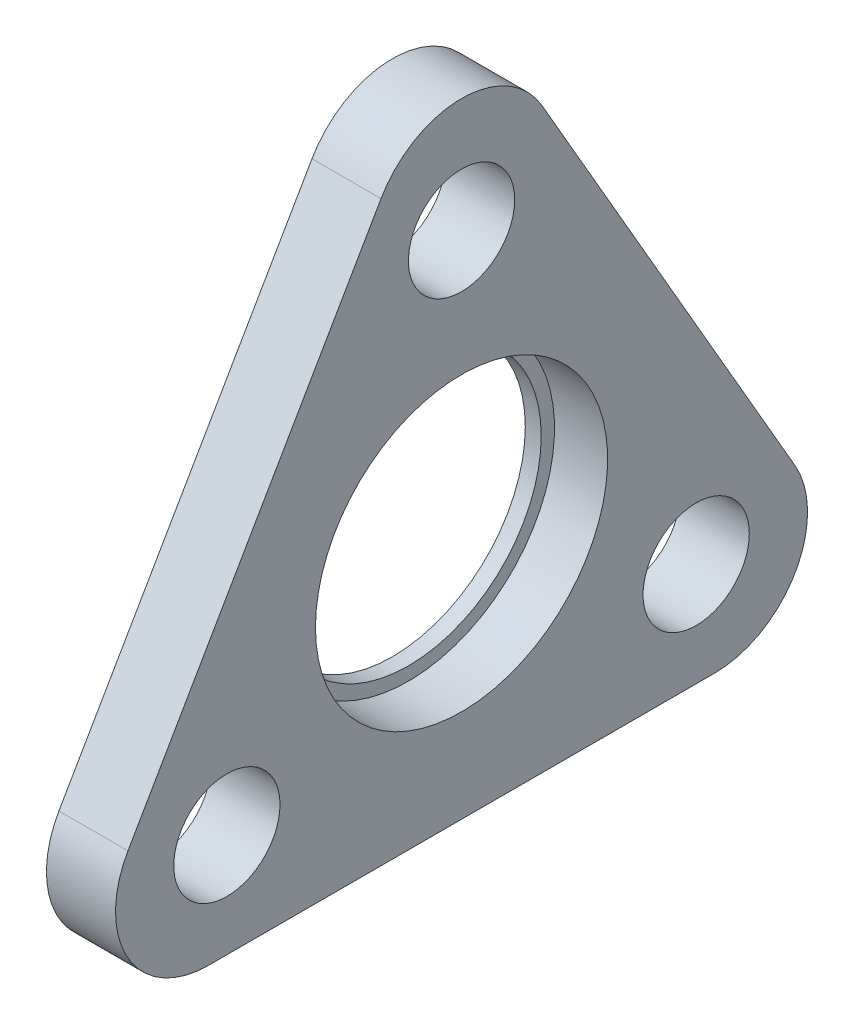
ISO-10303-21;
HEADER;
FILE_DESCRIPTION(('STEP AP214'),'2;1');
FILE_NAME('part.step','',(''),(''),'','','');
FILE_SCHEMA(('AUTOMOTIVE_DESIGN { 1 0 10303 214 1 1 1 1 }'));
ENDSEC;
DATA;
#1=APPLICATION_CONTEXT('core data for automotive mechanical design processes');
#2=APPLICATION_PROTOCOL_DEFINITION('international standard','automotive_design',2000,#1);
#3=PRODUCT_CONTEXT('',#1,'mechanical');
#4=PRODUCT('Part','Part','',(#3));
#5=PRODUCT_RELATED_PRODUCT_CATEGORY('part','',(#4));
#6=PRODUCT_DEFINITION_FORMATION('','',#4);
#7=PRODUCT_DEFINITION_CONTEXT('part definition',#1,'design');
#8=PRODUCT_DEFINITION('design','',#6,#7);
#9=PRODUCT_DEFINITION_SHAPE('','',#8);
#10=(LENGTH_UNIT() NAMED_UNIT(*) SI_UNIT(.MILLI.,.METRE.));
#11=(NAMED_UNIT(*) PLANE_ANGLE_UNIT() SI_UNIT($,.RADIAN.));
#12=(NAMED_UNIT(*) SI_UNIT($,.STERADIAN.) SOLID_ANGLE_UNIT());
#13=UNCERTAINTY_MEASURE_WITH_UNIT(LENGTH_MEASURE(1.E-05),#10,'distance_accuracy_value','');
#14=(GEOMETRIC_REPRESENTATION_CONTEXT(3) GLOBAL_UNCERTAINTY_ASSIGNED_CONTEXT((#13)) GLOBAL_UNIT_ASSIGNED_CONTEXT((#10,
#11,#12)) REPRESENTATION_CONTEXT('',''));
#15=CARTESIAN_POINT('',(0.,0.,0.));
#16=DIRECTION('',(0.,0.,1.));
#17=DIRECTION('',(1.,0.,0.));
#18=AXIS2_PLACEMENT_3D('',#15,#16,#17);
#19=CARTESIAN_POINT('',(0.6,0.,0.));
#20=DIRECTION('',(-1.,0.,0.));
#21=DIRECTION('',(0.,0.,1.));
#22=AXIS2_PLACEMENT_3D('',#19,#20,#21);
#23=CYLINDRICAL_SURFACE('',#22,5.5);
#24=CARTESIAN_POINT('',(0.6,0.,0.));
#25=DIRECTION('',(-1.,0.,0.));
#26=DIRECTION('',(0.,0.,1.));
#27=AXIS2_PLACEMENT_3D('',#24,#25,#26);
#28=CIRCLE('',#27,5.5);
#29=CARTESIAN_POINT('',(0.6,0.,5.5));
#30=VERTEX_POINT('',#29);
#31=EDGE_CURVE('E11',#30,#30,#28,.T.);
#32=ORIENTED_EDGE('',*,*,#31,.T.);
#33=EDGE_LOOP('',(#32));
#34=FACE_BOUND('',#33,.T.);
#35=CARTESIAN_POINT('',(0.,0.,0.));
#36=DIRECTION('',(-1.,0.,0.));
#37=DIRECTION('',(0.,0.,1.));
#38=AXIS2_PLACEMENT_3D('',#35,#36,#37);
#39=CIRCLE('',#38,5.5);
#40=CARTESIAN_POINT('',(0.,0.,5.5));
#41=VERTEX_POINT('',#40);
#42=EDGE_CURVE('E54',#41,#41,#39,.T.);
#43=ORIENTED_EDGE('',*,*,#42,.F.);
#44=EDGE_LOOP('',(#43));
#45=FACE_BOUND('',#44,.T.);
#46=ADVANCED_FACE('F51',(#34,#45),#23,.T.);
#47=CARTESIAN_POINT('',(0.6,0.,0.));
#48=DIRECTION('',(-1.,0.,0.));
#49=DIRECTION('',(0.,0.,1.));
#50=AXIS2_PLACEMENT_3D('',#47,#48,#49);
#51=PLANE('',#50);
#52=CARTESIAN_POINT('',(0.6,0.,0.));
#53=DIRECTION('',(-1.,0.,0.));
#54=DIRECTION('',(0.,0.,1.));
#55=AXIS2_PLACEMENT_3D('',#52,#53,#54);
#56=CIRCLE('',#55,5.);
#57=CARTESIAN_POINT('',(0.6,0.,5.));
#58=VERTEX_POINT('',#57);
#59=EDGE_CURVE('E61',#58,#58,#56,.T.);
#60=ORIENTED_EDGE('',*,*,#59,.T.);
#61=EDGE_LOOP('',(#60));
#62=FACE_BOUND('',#61,.T.);
#63=ORIENTED_EDGE('',*,*,#31,.F.);
#64=EDGE_LOOP('',(#63));
#65=FACE_BOUND('',#64,.T.);
#66=ADVANCED_FACE('F69',(#62,#65),#51,.F.);
#67=CARTESIAN_POINT('',(0.,0.,0.));
#68=DIRECTION('',(-1.,0.,0.));
#69=DIRECTION('',(0.,0.,1.));
#70=AXIS2_PLACEMENT_3D('',#67,#68,#69);
#71=PLANE('',#70);
#72=CARTESIAN_POINT('',(0.,0.,0.));
#73=DIRECTION('',(-1.,0.,0.));
#74=DIRECTION('',(0.,0.,1.));
#75=AXIS2_PLACEMENT_3D('',#72,#73,#74);
#76=CIRCLE('',#75,5.);
#77=CARTESIAN_POINT('',(0.,0.,5.));
#78=VERTEX_POINT('',#77);
#79=EDGE_CURVE('E63',#78,#78,#76,.T.);
#80=ORIENTED_EDGE('',*,*,#79,.F.);
#81=EDGE_LOOP('',(#80));
#82=FACE_BOUND('',#81,.T.);
#83=ORIENTED_EDGE('',*,*,#42,.T.);
#84=EDGE_LOOP('',(#83));
#85=FACE_BOUND('',#84,.T.);
#86=ADVANCED_FACE('F75',(#82,#85),#71,.T.);
#87=CARTESIAN_POINT('',(0.6,0.,0.));
#88=DIRECTION('',(-1.,0.,0.));
#89=DIRECTION('',(0.,0.,1.));
#90=AXIS2_PLACEMENT_3D('',#87,#88,#89);
#91=CYLINDRICAL_SURFACE('',#90,5.);
#92=ORIENTED_EDGE('',*,*,#59,.F.);
#93=EDGE_LOOP('',(#92));
#94=FACE_BOUND('',#93,.T.);
#95=ORIENTED_EDGE('',*,*,#79,.T.);
#96=EDGE_LOOP('',(#95));
#97=FACE_BOUND('',#96,.T.);
#98=ADVANCED_FACE('F72',(#94,#97),#91,.F.);
#99=CLOSED_SHELL('',(#46,#66,#86,#98));
#100=MANIFOLD_SOLID_BREP('B2',#99);
#101=CARTESIAN_POINT('',(2.6,4.49999999999996,7.79422863405993));
#102=DIRECTION('',(0.,-0.499999999999998,-0.86602540378444));
#103=DIRECTION('',(0.,0.86602540378444,-0.499999999999998));
#104=AXIS2_PLACEMENT_3D('',#101,#102,#103);
#105=PLANE('',#104);
#106=DIRECTION('',(0.,-0.86602540378444,0.499999999999998));
#107=VECTOR('',#106,1.);
#108=CARTESIAN_POINT('',(0.,4.49999999999996,7.79422863405993));
#109=LINE('',#108,#107);
#110=CARTESIAN_POINT('',(0.,12.75,3.03108891324554));
#111=VERTEX_POINT('',#110);
#112=CARTESIAN_POINT('',(0.,-3.75000000000009,12.5573683548743));
#113=VERTEX_POINT('',#112);
#114=EDGE_CURVE('E198',#111,#113,#109,.T.);
#115=ORIENTED_EDGE('',*,*,#114,.T.);
#116=DIRECTION('',(-1.,0.,0.));
#117=VECTOR('',#116,1.);
#118=CARTESIAN_POINT('',(2.6,-3.75000000000008,12.5573683548743));
#119=LINE('',#118,#117);
#120=CARTESIAN_POINT('',(2.6,-3.75000000000009,12.5573683548743));
#121=VERTEX_POINT('',#120);
#122=EDGE_CURVE('E173',#113,#121,#119,.F.);
#123=ORIENTED_EDGE('',*,*,#122,.T.);
#124=DIRECTION('',(0.,-0.86602540378444,0.499999999999998));
#125=VECTOR('',#124,1.);
#126=CARTESIAN_POINT('',(2.6,4.49999999999996,7.79422863405993));
#127=LINE('',#126,#125);
#128=CARTESIAN_POINT('',(2.6,12.75,3.03108891324554));
#129=VERTEX_POINT('',#128);
#130=EDGE_CURVE('E219',#129,#121,#127,.T.);
#131=ORIENTED_EDGE('',*,*,#130,.F.);
#132=DIRECTION('',(-1.,0.,0.));
#133=VECTOR('',#132,1.);
#134=CARTESIAN_POINT('',(2.6,12.75,3.03108891324554));
#135=LINE('',#134,#133);
#136=EDGE_CURVE('E179',#129,#111,#135,.T.);
#137=ORIENTED_EDGE('',*,*,#136,.T.);
#138=EDGE_LOOP('',(#115,#123,#131,#137));
#139=FACE_BOUND('',#138,.T.);
#140=ADVANCED_FACE('F113',(#139),#105,.F.);
#141=CARTESIAN_POINT('',(2.6,-9.00000000000008,0.));
#142=DIRECTION('',(0.,1.,0.));
#143=DIRECTION('',(0.,0.,1.));
#144=AXIS2_PLACEMENT_3D('',#141,#142,#143);
#145=PLANE('',#144);
#146=DIRECTION('',(0.,0.,-1.));
#147=VECTOR('',#146,1.);
#148=CARTESIAN_POINT('',(2.6,-9.00000000000008,0.));
#149=LINE('',#148,#147);
#150=CARTESIAN_POINT('',(2.6,-9.00000000000008,9.5262794416288));
#151=VERTEX_POINT('',#150);
#152=CARTESIAN_POINT('',(2.6,-9.00000000000008,-9.5262794416288));
#153=VERTEX_POINT('',#152);
#154=EDGE_CURVE('E188',#151,#153,#149,.T.);
#155=ORIENTED_EDGE('',*,*,#154,.F.);
#156=DIRECTION('',(-1.,0.,0.));
#157=VECTOR('',#156,1.);
#158=CARTESIAN_POINT('',(2.6,-9.00000000000008,9.5262794416288));
#159=LINE('',#158,#157);
#160=CARTESIAN_POINT('',(0.,-9.00000000000008,9.5262794416288));
#161=VERTEX_POINT('',#160);
#162=EDGE_CURVE('E172',#151,#161,#159,.T.);
#163=ORIENTED_EDGE('',*,*,#162,.T.);
#164=DIRECTION('',(0.,0.,-1.));
#165=VECTOR('',#164,1.);
#166=CARTESIAN_POINT('',(0.,-9.00000000000008,0.));
#167=LINE('',#166,#165);
#168=CARTESIAN_POINT('',(0.,-9.00000000000008,-9.5262794416288));
#169=VERTEX_POINT('',#168);
#170=EDGE_CURVE('E186',#161,#169,#167,.T.);
#171=ORIENTED_EDGE('',*,*,#170,.T.);
#172=DIRECTION('',(-1.,0.,0.));
#173=VECTOR('',#172,1.);
#174=CARTESIAN_POINT('',(2.6,-9.00000000000008,-9.5262794416288));
#175=LINE('',#174,#173);
#176=EDGE_CURVE('E191',#169,#153,#175,.F.);
#177=ORIENTED_EDGE('',*,*,#176,.T.);
#178=EDGE_LOOP('',(#155,#163,#171,#177));
#179=FACE_BOUND('',#178,.T.);
#180=ADVANCED_FACE('F185',(#179),#145,.F.);
#181=CARTESIAN_POINT('',(2.6,-5.09999999999962,-8.83345911860193));
#182=DIRECTION('',(-1.,0.,0.));
#183=DIRECTION('',(0.,0.,1.));
#184=AXIS2_PLACEMENT_3D('',#181,#182,#183);
#185=CYLINDRICAL_SURFACE('',#184,2.00000000000056);
#186=CARTESIAN_POINT('',(2.6,-5.09999999999962,-8.83345911860193));
#187=DIRECTION('',(1.,0.,0.));
#188=DIRECTION('',(0.,0.,-1.));
#189=AXIS2_PLACEMENT_3D('',#186,#187,#188);
#190=CIRCLE('',#189,2.00000000000056);
#191=CARTESIAN_POINT('',(2.6,-5.09999999999962,-10.8334591186025));
#192=VERTEX_POINT('',#191);
#193=EDGE_CURVE('E243',#192,#192,#190,.T.);
#194=ORIENTED_EDGE('',*,*,#193,.T.);
#195=EDGE_LOOP('',(#194));
#196=FACE_BOUND('',#195,.T.);
#197=CARTESIAN_POINT('',(0.,-5.09999999999962,-8.83345911860193));
#198=DIRECTION('',(1.,0.,0.));
#199=DIRECTION('',(0.,0.,-1.));
#200=AXIS2_PLACEMENT_3D('',#197,#198,#199);
#201=CIRCLE('',#200,2.00000000000056);
#202=CARTESIAN_POINT('',(0.,-5.09999999999962,-10.8334591186025));
#203=VERTEX_POINT('',#202);
#204=EDGE_CURVE('E211',#203,#203,#201,.T.);
#205=ORIENTED_EDGE('',*,*,#204,.F.);
#206=EDGE_LOOP('',(#205));
#207=FACE_BOUND('',#206,.T.);
#208=ADVANCED_FACE('F293',(#196,#207),#185,.F.);
#209=CARTESIAN_POINT('',(2.6,-5.10000000000038,8.83345911860062));
#210=DIRECTION('',(-1.,0.,0.));
#211=DIRECTION('',(0.,0.,1.));
#212=AXIS2_PLACEMENT_3D('',#209,#210,#211);
#213=CYLINDRICAL_SURFACE('',#212,2.00000000000083);
#214=CARTESIAN_POINT('',(2.6,-5.10000000000038,8.83345911860062));
#215=DIRECTION('',(1.,0.,0.));
#216=DIRECTION('',(0.,0.,-1.));
#217=AXIS2_PLACEMENT_3D('',#214,#215,#216);
#218=CIRCLE('',#217,2.00000000000083);
#219=CARTESIAN_POINT('',(2.6,-5.10000000000038,6.8334591185998));
#220=VERTEX_POINT('',#219);
#221=EDGE_CURVE('E246',#220,#220,#218,.T.);
#222=ORIENTED_EDGE('',*,*,#221,.T.);
#223=EDGE_LOOP('',(#222));
#224=FACE_BOUND('',#223,.T.);
#225=CARTESIAN_POINT('',(0.,-5.10000000000038,8.83345911860062));
#226=DIRECTION('',(1.,0.,0.));
#227=DIRECTION('',(0.,0.,-1.));
#228=AXIS2_PLACEMENT_3D('',#225,#226,#227);
#229=CIRCLE('',#228,2.00000000000083);
#230=CARTESIAN_POINT('',(0.,-5.10000000000038,6.8334591185998));
#231=VERTEX_POINT('',#230);
#232=EDGE_CURVE('E202',#231,#231,#229,.T.);
#233=ORIENTED_EDGE('',*,*,#232,.F.);
#234=EDGE_LOOP('',(#233));
#235=FACE_BOUND('',#234,.T.);
#236=ADVANCED_FACE('F320',(#224,#235),#213,.F.);
#237=CARTESIAN_POINT('',(2.6,4.49999999999996,-7.79422863405993));
#238=DIRECTION('',(0.,-0.499999999999998,0.86602540378444));
#239=DIRECTION('',(0.,-0.86602540378444,-0.499999999999998));
#240=AXIS2_PLACEMENT_3D('',#237,#238,#239);
#241=PLANE('',#240);
#242=DIRECTION('',(0.,0.86602540378444,0.499999999999998));
#243=VECTOR('',#242,1.);
#244=CARTESIAN_POINT('',(2.6,4.49999999999996,-7.79422863405993));
#245=LINE('',#244,#243);
#246=CARTESIAN_POINT('',(2.6,-3.75000000000008,-12.5573683548743));
#247=VERTEX_POINT('',#246);
#248=CARTESIAN_POINT('',(2.6,12.75,-3.03108891324554));
#249=VERTEX_POINT('',#248);
#250=EDGE_CURVE('E250',#247,#249,#245,.T.);
#251=ORIENTED_EDGE('',*,*,#250,.F.);
#252=DIRECTION('',(-1.,0.,0.));
#253=VECTOR('',#252,1.);
#254=CARTESIAN_POINT('',(2.6,-3.75000000000008,-12.5573683548743));
#255=LINE('',#254,#253);
#256=CARTESIAN_POINT('',(0.,-3.75000000000008,-12.5573683548743));
#257=VERTEX_POINT('',#256);
#258=EDGE_CURVE('E49',#247,#257,#255,.T.);
#259=ORIENTED_EDGE('',*,*,#258,.T.);
#260=DIRECTION('',(0.,0.86602540378444,0.499999999999998));
#261=VECTOR('',#260,1.);
#262=CARTESIAN_POINT('',(0.,4.49999999999996,-7.79422863405993));
#263=LINE('',#262,#261);
#264=CARTESIAN_POINT('',(0.,12.75,-3.03108891324554));
#265=VERTEX_POINT('',#264);
#266=EDGE_CURVE('E197',#257,#265,#263,.T.);
#267=ORIENTED_EDGE('',*,*,#266,.T.);
#268=DIRECTION('',(-1.,0.,0.));
#269=VECTOR('',#268,1.);
#270=CARTESIAN_POINT('',(2.6,12.75,-3.03108891324554));
#271=LINE('',#270,#269);
#272=EDGE_CURVE('E122',#265,#249,#271,.F.);
#273=ORIENTED_EDGE('',*,*,#272,.T.);
#274=EDGE_LOOP('',(#251,#259,#267,#273));
#275=FACE_BOUND('',#274,.T.);
#276=ADVANCED_FACE('F303',(#275),#241,.F.);
#277=CARTESIAN_POINT('',(2.6,10.2,0.));
#278=DIRECTION('',(-1.,0.,0.));
#279=DIRECTION('',(0.,0.,1.));
#280=AXIS2_PLACEMENT_3D('',#277,#278,#279);
#281=CYLINDRICAL_SURFACE('',#280,2.);
#282=CARTESIAN_POINT('',(2.6,10.2,0.));
#283=DIRECTION('',(1.,0.,0.));
#284=DIRECTION('',(0.,0.,-1.));
#285=AXIS2_PLACEMENT_3D('',#282,#283,#284);
#286=CIRCLE('',#285,2.);
#287=CARTESIAN_POINT('',(2.6,10.2,-2.));
#288=VERTEX_POINT('',#287);
#289=EDGE_CURVE('E221',#288,#288,#286,.T.);
#290=ORIENTED_EDGE('',*,*,#289,.T.);
#291=EDGE_LOOP('',(#290));
#292=FACE_BOUND('',#291,.T.);
#293=CARTESIAN_POINT('',(0.,10.2,0.));
#294=DIRECTION('',(1.,0.,0.));
#295=DIRECTION('',(0.,0.,-1.));
#296=AXIS2_PLACEMENT_3D('',#293,#294,#295);
#297=CIRCLE('',#296,2.);
#298=CARTESIAN_POINT('',(0.,10.2,-2.));
#299=VERTEX_POINT('',#298);
#300=EDGE_CURVE('E215',#299,#299,#297,.T.);
#301=ORIENTED_EDGE('',*,*,#300,.F.);
#302=EDGE_LOOP('',(#301));
#303=FACE_BOUND('',#302,.T.);
#304=ADVANCED_FACE('F284',(#292,#303),#281,.F.);
#305=CARTESIAN_POINT('',(2.6,0.,0.));
#306=DIRECTION('',(1.,0.,0.));
#307=DIRECTION('',(0.,0.,-1.));
#308=AXIS2_PLACEMENT_3D('',#305,#306,#307);
#309=PLANE('',#308);
#310=CARTESIAN_POINT('',(2.6,0.,0.));
#311=DIRECTION('',(-1.,0.,0.));
#312=DIRECTION('',(0.,0.,1.));
#313=AXIS2_PLACEMENT_3D('',#310,#311,#312);
#314=CIRCLE('',#313,5.5);
#315=CARTESIAN_POINT('',(2.6,0.,5.5));
#316=VERTEX_POINT('',#315);
#317=EDGE_CURVE('E204',#316,#316,#314,.T.);
#318=ORIENTED_EDGE('',*,*,#317,.T.);
#319=EDGE_LOOP('',(#318));
#320=FACE_BOUND('',#319,.T.);
#321=ORIENTED_EDGE('',*,*,#130,.T.);
#322=CARTESIAN_POINT('',(2.6,-5.50000000000008,9.5262794416288));
#323=DIRECTION('',(1.,0.,0.));
#324=DIRECTION('',(0.,0.,-1.));
#325=AXIS2_PLACEMENT_3D('',#322,#323,#324);
#326=CIRCLE('',#325,3.5);
#327=EDGE_CURVE('E237',#121,#151,#326,.T.);
#328=ORIENTED_EDGE('',*,*,#327,.T.);
#329=ORIENTED_EDGE('',*,*,#154,.T.);
#330=CARTESIAN_POINT('',(2.6,-5.50000000000008,-9.5262794416288));
#331=DIRECTION('',(1.,0.,0.));
#332=DIRECTION('',(0.,0.,-1.));
#333=AXIS2_PLACEMENT_3D('',#330,#331,#332);
#334=CIRCLE('',#333,3.5);
#335=EDGE_CURVE('E135',#153,#247,#334,.T.);
#336=ORIENTED_EDGE('',*,*,#335,.T.);
#337=ORIENTED_EDGE('',*,*,#250,.T.);
#338=CARTESIAN_POINT('',(2.6,11.,0.));
#339=DIRECTION('',(1.,0.,0.));
#340=DIRECTION('',(0.,0.,-1.));
#341=AXIS2_PLACEMENT_3D('',#338,#339,#340);
#342=CIRCLE('',#341,3.5);
#343=EDGE_CURVE('E232',#249,#129,#342,.T.);
#344=ORIENTED_EDGE('',*,*,#343,.T.);
#345=EDGE_LOOP('',(#321,#328,#329,#336,#337,#344));
#346=FACE_BOUND('',#345,.T.);
#347=ORIENTED_EDGE('',*,*,#221,.F.);
#348=EDGE_LOOP('',(#347));
#349=FACE_BOUND('',#348,.T.);
#350=ORIENTED_EDGE('',*,*,#193,.F.);
#351=EDGE_LOOP('',(#350));
#352=FACE_BOUND('',#351,.T.);
#353=ORIENTED_EDGE('',*,*,#289,.F.);
#354=EDGE_LOOP('',(#353));
#355=FACE_BOUND('',#354,.T.);
#356=ADVANCED_FACE('F268',(#320,#346,#349,#352,#355),#309,.T.);
#357=CARTESIAN_POINT('',(0.,0.,0.));
#358=DIRECTION('',(1.,0.,0.));
#359=DIRECTION('',(0.,0.,-1.));
#360=AXIS2_PLACEMENT_3D('',#357,#358,#359);
#361=PLANE('',#360);
#362=CARTESIAN_POINT('',(0.,0.,0.));
#363=DIRECTION('',(-1.,0.,0.));
#364=DIRECTION('',(0.,0.,1.));
#365=AXIS2_PLACEMENT_3D('',#362,#363,#364);
#366=CIRCLE('',#365,5.5);
#367=CARTESIAN_POINT('',(0.,0.,5.5));
#368=VERTEX_POINT('',#367);
#369=EDGE_CURVE('E260',#368,#368,#366,.T.);
#370=ORIENTED_EDGE('',*,*,#369,.F.);
#371=EDGE_LOOP('',(#370));
#372=FACE_BOUND('',#371,.T.);
#373=ORIENTED_EDGE('',*,*,#170,.F.);
#374=CARTESIAN_POINT('',(0.,-5.50000000000008,9.5262794416288));
#375=DIRECTION('',(1.,0.,0.));
#376=DIRECTION('',(0.,0.,-1.));
#377=AXIS2_PLACEMENT_3D('',#374,#375,#376);
#378=CIRCLE('',#377,3.5);
#379=EDGE_CURVE('E168',#161,#113,#378,.F.);
#380=ORIENTED_EDGE('',*,*,#379,.T.);
#381=ORIENTED_EDGE('',*,*,#114,.F.);
#382=CARTESIAN_POINT('',(0.,11.,0.));
#383=DIRECTION('',(1.,0.,0.));
#384=DIRECTION('',(0.,0.,-1.));
#385=AXIS2_PLACEMENT_3D('',#382,#383,#384);
#386=CIRCLE('',#385,3.5);
#387=EDGE_CURVE('E190',#111,#265,#386,.F.);
#388=ORIENTED_EDGE('',*,*,#387,.T.);
#389=ORIENTED_EDGE('',*,*,#266,.F.);
#390=CARTESIAN_POINT('',(0.,-5.50000000000008,-9.5262794416288));
#391=DIRECTION('',(1.,0.,0.));
#392=DIRECTION('',(0.,0.,-1.));
#393=AXIS2_PLACEMENT_3D('',#390,#391,#392);
#394=CIRCLE('',#393,3.5);
#395=EDGE_CURVE('E180',#257,#169,#394,.F.);
#396=ORIENTED_EDGE('',*,*,#395,.T.);
#397=EDGE_LOOP('',(#373,#380,#381,#388,#389,#396));
#398=FACE_BOUND('',#397,.T.);
#399=ORIENTED_EDGE('',*,*,#232,.T.);
#400=EDGE_LOOP('',(#399));
#401=FACE_BOUND('',#400,.T.);
#402=ORIENTED_EDGE('',*,*,#204,.T.);
#403=EDGE_LOOP('',(#402));
#404=FACE_BOUND('',#403,.T.);
#405=ORIENTED_EDGE('',*,*,#300,.T.);
#406=EDGE_LOOP('',(#405));
#407=FACE_BOUND('',#406,.T.);
#408=ADVANCED_FACE('F193',(#372,#398,#401,#404,#407),#361,.F.);
#409=CARTESIAN_POINT('',(2.6,-5.50000000000008,9.5262794416288));
#410=DIRECTION('',(-1.,0.,0.));
#411=DIRECTION('',(0.,0.,1.));
#412=AXIS2_PLACEMENT_3D('',#409,#410,#411);
#413=CYLINDRICAL_SURFACE('',#412,3.5);
#414=ORIENTED_EDGE('',*,*,#327,.F.);
#415=ORIENTED_EDGE('',*,*,#122,.F.);
#416=ORIENTED_EDGE('',*,*,#379,.F.);
#417=ORIENTED_EDGE('',*,*,#162,.F.);
#418=EDGE_LOOP('',(#414,#415,#416,#417));
#419=FACE_BOUND('',#418,.T.);
#420=ADVANCED_FACE('F171',(#419),#413,.T.);
#421=CARTESIAN_POINT('',(2.6,-5.50000000000008,-9.5262794416288));
#422=DIRECTION('',(-1.,0.,0.));
#423=DIRECTION('',(0.,0.,1.));
#424=AXIS2_PLACEMENT_3D('',#421,#422,#423);
#425=CYLINDRICAL_SURFACE('',#424,3.5);
#426=ORIENTED_EDGE('',*,*,#335,.F.);
#427=ORIENTED_EDGE('',*,*,#176,.F.);
#428=ORIENTED_EDGE('',*,*,#395,.F.);
#429=ORIENTED_EDGE('',*,*,#258,.F.);
#430=EDGE_LOOP('',(#426,#427,#428,#429));
#431=FACE_BOUND('',#430,.T.);
#432=ADVANCED_FACE('F282',(#431),#425,.T.);
#433=CARTESIAN_POINT('',(2.6,11.,0.));
#434=DIRECTION('',(-1.,0.,0.));
#435=DIRECTION('',(0.,0.,1.));
#436=AXIS2_PLACEMENT_3D('',#433,#434,#435);
#437=CYLINDRICAL_SURFACE('',#436,3.5);
#438=ORIENTED_EDGE('',*,*,#343,.F.);
#439=ORIENTED_EDGE('',*,*,#272,.F.);
#440=ORIENTED_EDGE('',*,*,#387,.F.);
#441=ORIENTED_EDGE('',*,*,#136,.F.);
#442=EDGE_LOOP('',(#438,#439,#440,#441));
#443=FACE_BOUND('',#442,.T.);
#444=ADVANCED_FACE('F115',(#443),#437,.T.);
#445=CARTESIAN_POINT('',(2.6,0.,0.));
#446=DIRECTION('',(-1.,0.,0.));
#447=DIRECTION('',(0.,0.,1.));
#448=AXIS2_PLACEMENT_3D('',#445,#446,#447);
#449=CYLINDRICAL_SURFACE('',#448,5.5);
#450=ORIENTED_EDGE('',*,*,#317,.F.);
#451=EDGE_LOOP('',(#450));
#452=FACE_BOUND('',#451,.T.);
#453=ORIENTED_EDGE('',*,*,#369,.T.);
#454=EDGE_LOOP('',(#453));
#455=FACE_BOUND('',#454,.T.);
#456=ADVANCED_FACE('F270',(#452,#455),#449,.F.);
#457=CLOSED_SHELL('',(#140,#180,#208,#236,#276,#304,#356,#408,#420,#432,#444,#456));
#458=MANIFOLD_SOLID_BREP('B6',#457);
#459=ADVANCED_BREP_SHAPE_REPRESENTATION('',(#18,#100,#458),#14);
#460=SHAPE_DEFINITION_REPRESENTATION(#9,#459);
ENDSEC;
END-ISO-10303-21;
